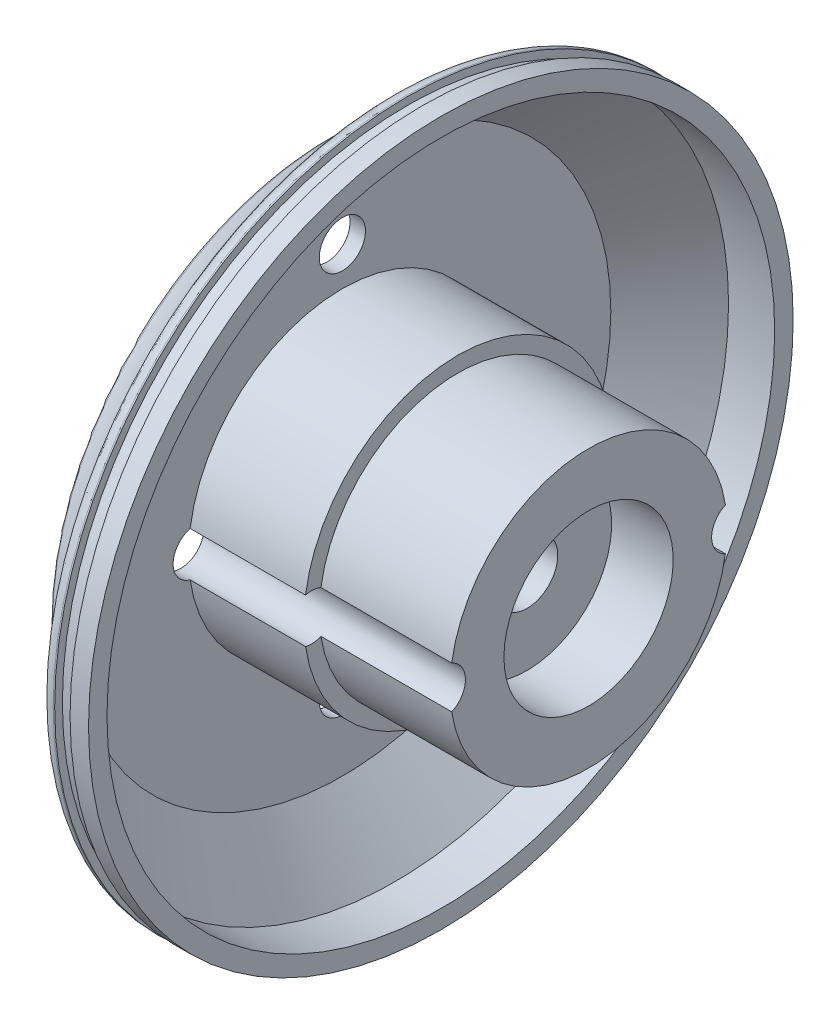
ISO-10303-21;
HEADER;
FILE_DESCRIPTION(('STEP AP214'),'2;1');
FILE_NAME('part.step','',(''),(''),'','','');
FILE_SCHEMA(('AUTOMOTIVE_DESIGN { 1 0 10303 214 1 1 1 1 }'));
ENDSEC;
DATA;
#1=APPLICATION_CONTEXT('core data for automotive mechanical design processes');
#2=APPLICATION_PROTOCOL_DEFINITION('international standard','automotive_design',2000,#1);
#3=PRODUCT_CONTEXT('',#1,'mechanical');
#4=PRODUCT('Part','Part','',(#3));
#5=PRODUCT_RELATED_PRODUCT_CATEGORY('part','',(#4));
#6=PRODUCT_DEFINITION_FORMATION('','',#4);
#7=PRODUCT_DEFINITION_CONTEXT('part definition',#1,'design');
#8=PRODUCT_DEFINITION('design','',#6,#7);
#9=PRODUCT_DEFINITION_SHAPE('','',#8);
#10=(LENGTH_UNIT() NAMED_UNIT(*) SI_UNIT(.MILLI.,.METRE.));
#11=(NAMED_UNIT(*) PLANE_ANGLE_UNIT() SI_UNIT($,.RADIAN.));
#12=(NAMED_UNIT(*) SI_UNIT($,.STERADIAN.) SOLID_ANGLE_UNIT());
#13=UNCERTAINTY_MEASURE_WITH_UNIT(LENGTH_MEASURE(1.E-05),#10,'distance_accuracy_value','');
#14=(GEOMETRIC_REPRESENTATION_CONTEXT(3) GLOBAL_UNCERTAINTY_ASSIGNED_CONTEXT((#13)) GLOBAL_UNIT_ASSIGNED_CONTEXT((#10,
#11,#12)) REPRESENTATION_CONTEXT('',''));
#15=CARTESIAN_POINT('',(0.,0.,0.));
#16=DIRECTION('',(0.,0.,1.));
#17=DIRECTION('',(1.,0.,0.));
#18=AXIS2_PLACEMENT_3D('',#15,#16,#17);
#19=CARTESIAN_POINT('',(0.,0.,0.));
#20=DIRECTION('',(-1.,0.,0.));
#21=DIRECTION('',(0.,0.,1.));
#22=AXIS2_PLACEMENT_3D('',#19,#20,#21);
#23=CYLINDRICAL_SURFACE('',#22,9.);
#24=CARTESIAN_POINT('',(8.5,0.,0.));
#25=DIRECTION('',(-1.,0.,0.));
#26=DIRECTION('',(0.,0.,1.));
#27=AXIS2_PLACEMENT_3D('',#24,#25,#26);
#28=CIRCLE('',#27,9.);
#29=CARTESIAN_POINT('',(8.5,1.37246366425319,8.89473684210526));
#30=VERTEX_POINT('',#29);
#31=CARTESIAN_POINT('',(8.5,1.37246366425319,-8.89473684210526));
#32=VERTEX_POINT('',#31);
#33=EDGE_CURVE('E126',#30,#32,#28,.T.);
#34=ORIENTED_EDGE('',*,*,#33,.F.);
#35=DIRECTION('',(-1.,0.,0.));
#36=VECTOR('',#35,1.);
#37=CARTESIAN_POINT('',(8.5,1.37246366425319,8.89473684210526));
#38=LINE('',#37,#36);
#39=CARTESIAN_POINT('',(17.,1.37246366425319,8.89473684210526));
#40=VERTEX_POINT('',#39);
#41=EDGE_CURVE('E109',#30,#40,#38,.F.);
#42=ORIENTED_EDGE('',*,*,#41,.T.);
#43=CARTESIAN_POINT('',(17.,0.,0.));
#44=DIRECTION('',(-1.,0.,0.));
#45=DIRECTION('',(0.,0.,1.));
#46=AXIS2_PLACEMENT_3D('',#43,#44,#45);
#47=CIRCLE('',#46,9.);
#48=CARTESIAN_POINT('',(17.,1.37246366425319,-8.89473684210526));
#49=VERTEX_POINT('',#48);
#50=EDGE_CURVE('E124',#40,#49,#47,.T.);
#51=ORIENTED_EDGE('',*,*,#50,.T.);
#52=DIRECTION('',(-1.,0.,0.));
#53=VECTOR('',#52,1.);
#54=CARTESIAN_POINT('',(8.5,1.37246366425319,-8.89473684210526));
#55=LINE('',#54,#53);
#56=EDGE_CURVE('E215',#49,#32,#55,.T.);
#57=ORIENTED_EDGE('',*,*,#56,.T.);
#58=EDGE_LOOP('',(#34,#42,#51,#57));
#59=FACE_BOUND('',#58,.T.);
#60=ADVANCED_FACE('F41',(#59),#23,.T.);
#61=CARTESIAN_POINT('',(8.5,0.,0.));
#62=DIRECTION('',(-1.,0.,0.));
#63=DIRECTION('',(0.,0.,1.));
#64=AXIS2_PLACEMENT_3D('',#61,#62,#63);
#65=PLANE('',#64);
#66=CARTESIAN_POINT('',(8.5,0.,0.));
#67=DIRECTION('',(-1.,0.,0.));
#68=DIRECTION('',(0.,0.,1.));
#69=AXIS2_PLACEMENT_3D('',#66,#67,#68);
#70=CIRCLE('',#69,10.);
#71=CARTESIAN_POINT('',(8.5,1.44712916682816,9.89473684210526));
#72=VERTEX_POINT('',#71);
#73=CARTESIAN_POINT('',(8.5,1.44712916682816,-9.89473684210526));
#74=VERTEX_POINT('',#73);
#75=EDGE_CURVE('E258',#72,#74,#70,.T.);
#76=ORIENTED_EDGE('',*,*,#75,.F.);
#77=CARTESIAN_POINT('',(8.5,0.,9.5));
#78=DIRECTION('',(-1.,0.,0.));
#79=DIRECTION('',(0.,0.,1.));
#80=AXIS2_PLACEMENT_3D('',#77,#78,#79);
#81=CIRCLE('',#80,1.5);
#82=EDGE_CURVE('E293',#72,#30,#81,.T.);
#83=ORIENTED_EDGE('',*,*,#82,.T.);
#84=ORIENTED_EDGE('',*,*,#33,.T.);
#85=CARTESIAN_POINT('',(8.5,0.,-9.5));
#86=DIRECTION('',(-1.,0.,0.));
#87=DIRECTION('',(0.,0.,1.));
#88=AXIS2_PLACEMENT_3D('',#85,#86,#87);
#89=CIRCLE('',#88,1.5);
#90=EDGE_CURVE('E214',#32,#74,#89,.T.);
#91=ORIENTED_EDGE('',*,*,#90,.T.);
#92=EDGE_LOOP('',(#76,#83,#84,#91));
#93=FACE_BOUND('',#92,.T.);
#94=ADVANCED_FACE('F276',(#93),#65,.F.);
#95=CARTESIAN_POINT('',(0.,0.,0.));
#96=DIRECTION('',(-1.,0.,0.));
#97=DIRECTION('',(0.,0.,1.));
#98=AXIS2_PLACEMENT_3D('',#95,#96,#97);
#99=CYLINDRICAL_SURFACE('',#98,10.);
#100=DIRECTION('',(-1.,0.,0.));
#101=VECTOR('',#100,1.);
#102=CARTESIAN_POINT('',(8.5,1.44712916682816,9.89473684210526));
#103=LINE('',#102,#101);
#104=CARTESIAN_POINT('',(0.999999999999997,1.44712916682816,9.89473684210526));
#105=VERTEX_POINT('',#104);
#106=EDGE_CURVE('E57',#72,#105,#103,.T.);
#107=ORIENTED_EDGE('',*,*,#106,.F.);
#108=ORIENTED_EDGE('',*,*,#75,.T.);
#109=DIRECTION('',(-1.,0.,0.));
#110=VECTOR('',#109,1.);
#111=CARTESIAN_POINT('',(8.5,1.44712916682816,-9.89473684210526));
#112=LINE('',#111,#110);
#113=CARTESIAN_POINT('',(0.999999999999997,1.44712916682816,-9.89473684210526));
#114=VERTEX_POINT('',#113);
#115=EDGE_CURVE('E203',#114,#74,#112,.F.);
#116=ORIENTED_EDGE('',*,*,#115,.F.);
#117=CARTESIAN_POINT('',(1.,0.,0.));
#118=DIRECTION('',(-1.,0.,0.));
#119=DIRECTION('',(0.,0.,1.));
#120=AXIS2_PLACEMENT_3D('',#117,#118,#119);
#121=CIRCLE('',#120,10.);
#122=EDGE_CURVE('E254',#105,#114,#121,.T.);
#123=ORIENTED_EDGE('',*,*,#122,.F.);
#124=EDGE_LOOP('',(#107,#108,#116,#123));
#125=FACE_BOUND('',#124,.T.);
#126=ADVANCED_FACE('F270',(#125),#99,.T.);
#127=CARTESIAN_POINT('',(-6.18335473428844,0.,0.));
#128=DIRECTION('',(-1.,0.,0.));
#129=DIRECTION('',(0.,0.,1.));
#130=AXIS2_PLACEMENT_3D('',#127,#128,#129);
#131=TOROIDAL_SURFACE('',#130,28.194917613122,11.9235154593095);
#132=CARTESIAN_POINT('',(4.23006744782491,0.,0.));
#133=DIRECTION('',(-1.,0.,0.));
#134=DIRECTION('',(0.,0.,1.));
#135=AXIS2_PLACEMENT_3D('',#132,#133,#134);
#136=CIRCLE('',#135,22.3870901909733);
#137=CARTESIAN_POINT('',(4.23006744782491,0.,22.3870901909733));
#138=VERTEX_POINT('',#137);
#139=EDGE_CURVE('E172',#138,#138,#136,.T.);
#140=ORIENTED_EDGE('',*,*,#139,.T.);
#141=EDGE_LOOP('',(#140));
#142=FACE_BOUND('',#141,.T.);
#143=CARTESIAN_POINT('',(0.444164031303579,0.,0.));
#144=DIRECTION('',(-1.,0.,0.));
#145=DIRECTION('',(0.,0.,1.));
#146=AXIS2_PLACEMENT_3D('',#143,#144,#145);
#147=CIRCLE('',#146,18.2829946957402);
#148=CARTESIAN_POINT('',(0.444164031303579,0.,18.2829946957402));
#149=VERTEX_POINT('',#148);
#150=EDGE_CURVE('E168',#149,#149,#147,.F.);
#151=ORIENTED_EDGE('',*,*,#150,.T.);
#152=EDGE_LOOP('',(#151));
#153=FACE_BOUND('',#152,.T.);
#154=ADVANCED_FACE('F339',(#142,#153),#131,.F.);
#155=CARTESIAN_POINT('',(0.,0.,0.));
#156=DIRECTION('',(-1.,0.,0.));
#157=DIRECTION('',(0.,0.,1.));
#158=AXIS2_PLACEMENT_3D('',#155,#156,#157);
#159=PLANE('',#158);
#160=CARTESIAN_POINT('',(0.,-12.5,0.));
#161=DIRECTION('',(-1.,0.,0.));
#162=DIRECTION('',(0.,-1.,0.));
#163=AXIS2_PLACEMENT_3D('',#160,#161,#162);
#164=CIRCLE('',#163,1.5);
#165=CARTESIAN_POINT('',(0.,-14.,0.));
#166=VERTEX_POINT('',#165);
#167=EDGE_CURVE('E422',#166,#166,#164,.T.);
#168=ORIENTED_EDGE('',*,*,#167,.F.);
#169=EDGE_LOOP('',(#168));
#170=FACE_BOUND('',#169,.T.);
#171=CARTESIAN_POINT('',(0.,0.,9.5));
#172=DIRECTION('',(-1.,0.,0.));
#173=DIRECTION('',(0.,-1.,0.));
#174=AXIS2_PLACEMENT_3D('',#171,#172,#173);
#175=CIRCLE('',#174,1.5);
#176=CARTESIAN_POINT('',(0.,-1.5,9.5));
#177=VERTEX_POINT('',#176);
#178=EDGE_CURVE('E119',#177,#177,#175,.T.);
#179=ORIENTED_EDGE('',*,*,#178,.F.);
#180=EDGE_LOOP('',(#179));
#181=FACE_BOUND('',#180,.T.);
#182=CARTESIAN_POINT('',(0.,12.5,0.));
#183=DIRECTION('',(-1.,0.,0.));
#184=DIRECTION('',(0.,-1.,0.));
#185=AXIS2_PLACEMENT_3D('',#182,#183,#184);
#186=CIRCLE('',#185,1.5);
#187=CARTESIAN_POINT('',(0.,11.,0.));
#188=VERTEX_POINT('',#187);
#189=EDGE_CURVE('E128',#188,#188,#186,.T.);
#190=ORIENTED_EDGE('',*,*,#189,.F.);
#191=EDGE_LOOP('',(#190));
#192=FACE_BOUND('',#191,.T.);
#193=CARTESIAN_POINT('',(0.,0.,-9.5));
#194=DIRECTION('',(-1.,0.,0.));
#195=DIRECTION('',(0.,-1.,0.));
#196=AXIS2_PLACEMENT_3D('',#193,#194,#195);
#197=CIRCLE('',#196,1.5);
#198=CARTESIAN_POINT('',(0.,-1.5,-9.5));
#199=VERTEX_POINT('',#198);
#200=EDGE_CURVE('E189',#199,#199,#197,.T.);
#201=ORIENTED_EDGE('',*,*,#200,.F.);
#202=EDGE_LOOP('',(#201));
#203=FACE_BOUND('',#202,.T.);
#204=CARTESIAN_POINT('',(0.,0.,0.));
#205=DIRECTION('',(-1.,0.,0.));
#206=DIRECTION('',(0.,0.,1.));
#207=AXIS2_PLACEMENT_3D('',#204,#205,#206);
#208=CIRCLE('',#207,17.4517027037763);
#209=CARTESIAN_POINT('',(0.,0.,17.4517027037763));
#210=VERTEX_POINT('',#209);
#211=EDGE_CURVE('E180',#210,#210,#208,.T.);
#212=ORIENTED_EDGE('',*,*,#211,.T.);
#213=EDGE_LOOP('',(#212));
#214=FACE_BOUND('',#213,.T.);
#215=CARTESIAN_POINT('',(0.,0.,0.));
#216=DIRECTION('',(-1.,0.,0.));
#217=DIRECTION('',(0.,0.,1.));
#218=AXIS2_PLACEMENT_3D('',#215,#216,#217);
#219=CIRCLE('',#218,5.5);
#220=CARTESIAN_POINT('',(0.,0.,5.5));
#221=VERTEX_POINT('',#220);
#222=EDGE_CURVE('E164',#221,#221,#219,.T.);
#223=ORIENTED_EDGE('',*,*,#222,.F.);
#224=EDGE_LOOP('',(#223));
#225=FACE_BOUND('',#224,.T.);
#226=ADVANCED_FACE('F335',(#170,#181,#192,#203,#214,#225),#159,.T.);
#227=CARTESIAN_POINT('',(0.,0.,0.));
#228=DIRECTION('',(-1.,0.,0.));
#229=DIRECTION('',(0.,0.,1.));
#230=AXIS2_PLACEMENT_3D('',#227,#228,#229);
#231=CYLINDRICAL_SURFACE('',#230,5.5);
#232=ORIENTED_EDGE('',*,*,#222,.T.);
#233=EDGE_LOOP('',(#232));
#234=FACE_BOUND('',#233,.T.);
#235=CARTESIAN_POINT('',(4.,0.,0.));
#236=DIRECTION('',(-1.,0.,0.));
#237=DIRECTION('',(0.,0.,1.));
#238=AXIS2_PLACEMENT_3D('',#235,#236,#237);
#239=CIRCLE('',#238,5.5);
#240=CARTESIAN_POINT('',(4.,0.,5.5));
#241=VERTEX_POINT('',#240);
#242=EDGE_CURVE('E160',#241,#241,#239,.T.);
#243=ORIENTED_EDGE('',*,*,#242,.F.);
#244=EDGE_LOOP('',(#243));
#245=FACE_BOUND('',#244,.T.);
#246=ADVANCED_FACE('F331',(#234,#245),#231,.F.);
#247=CARTESIAN_POINT('',(4.,0.,0.));
#248=DIRECTION('',(-1.,0.,0.));
#249=DIRECTION('',(0.,0.,1.));
#250=AXIS2_PLACEMENT_3D('',#247,#248,#249);
#251=PLANE('',#250);
#252=ORIENTED_EDGE('',*,*,#242,.T.);
#253=EDGE_LOOP('',(#252));
#254=FACE_BOUND('',#253,.T.);
#255=CARTESIAN_POINT('',(4.,0.,0.));
#256=DIRECTION('',(-1.,0.,0.));
#257=DIRECTION('',(0.,0.,1.));
#258=AXIS2_PLACEMENT_3D('',#255,#256,#257);
#259=CIRCLE('',#258,2.);
#260=CARTESIAN_POINT('',(4.,0.,2.));
#261=VERTEX_POINT('',#260);
#262=EDGE_CURVE('E156',#261,#261,#259,.T.);
#263=ORIENTED_EDGE('',*,*,#262,.F.);
#264=EDGE_LOOP('',(#263));
#265=FACE_BOUND('',#264,.T.);
#266=ADVANCED_FACE('F327',(#254,#265),#251,.T.);
#267=CARTESIAN_POINT('',(0.,0.,0.));
#268=DIRECTION('',(-1.,0.,0.));
#269=DIRECTION('',(0.,0.,1.));
#270=AXIS2_PLACEMENT_3D('',#267,#268,#269);
#271=CYLINDRICAL_SURFACE('',#270,2.);
#272=ORIENTED_EDGE('',*,*,#262,.T.);
#273=EDGE_LOOP('',(#272));
#274=FACE_BOUND('',#273,.T.);
#275=CARTESIAN_POINT('',(13.,0.,0.));
#276=DIRECTION('',(-1.,0.,0.));
#277=DIRECTION('',(0.,0.,1.));
#278=AXIS2_PLACEMENT_3D('',#275,#276,#277);
#279=CIRCLE('',#278,2.);
#280=CARTESIAN_POINT('',(13.,0.,2.));
#281=VERTEX_POINT('',#280);
#282=EDGE_CURVE('E152',#281,#281,#279,.T.);
#283=ORIENTED_EDGE('',*,*,#282,.F.);
#284=EDGE_LOOP('',(#283));
#285=FACE_BOUND('',#284,.T.);
#286=ADVANCED_FACE('F323',(#274,#285),#271,.F.);
#287=CARTESIAN_POINT('',(13.,0.,0.));
#288=DIRECTION('',(1.,0.,0.));
#289=DIRECTION('',(0.,0.,-1.));
#290=AXIS2_PLACEMENT_3D('',#287,#288,#289);
#291=PLANE('',#290);
#292=ORIENTED_EDGE('',*,*,#282,.T.);
#293=EDGE_LOOP('',(#292));
#294=FACE_BOUND('',#293,.T.);
#295=CARTESIAN_POINT('',(13.,0.,0.));
#296=DIRECTION('',(-1.,0.,0.));
#297=DIRECTION('',(0.,0.,1.));
#298=AXIS2_PLACEMENT_3D('',#295,#296,#297);
#299=CIRCLE('',#298,5.5);
#300=CARTESIAN_POINT('',(13.,0.,5.5));
#301=VERTEX_POINT('',#300);
#302=EDGE_CURVE('E148',#301,#301,#299,.T.);
#303=ORIENTED_EDGE('',*,*,#302,.F.);
#304=EDGE_LOOP('',(#303));
#305=FACE_BOUND('',#304,.T.);
#306=ADVANCED_FACE('F319',(#294,#305),#291,.T.);
#307=CARTESIAN_POINT('',(0.,0.,0.));
#308=DIRECTION('',(-1.,0.,0.));
#309=DIRECTION('',(0.,0.,1.));
#310=AXIS2_PLACEMENT_3D('',#307,#308,#309);
#311=CYLINDRICAL_SURFACE('',#310,5.5);
#312=ORIENTED_EDGE('',*,*,#302,.T.);
#313=EDGE_LOOP('',(#312));
#314=FACE_BOUND('',#313,.T.);
#315=CARTESIAN_POINT('',(17.,0.,0.));
#316=DIRECTION('',(-1.,0.,0.));
#317=DIRECTION('',(0.,0.,1.));
#318=AXIS2_PLACEMENT_3D('',#315,#316,#317);
#319=CIRCLE('',#318,5.5);
#320=CARTESIAN_POINT('',(17.,0.,5.5));
#321=VERTEX_POINT('',#320);
#322=EDGE_CURVE('E140',#321,#321,#319,.T.);
#323=ORIENTED_EDGE('',*,*,#322,.F.);
#324=EDGE_LOOP('',(#323));
#325=FACE_BOUND('',#324,.T.);
#326=ADVANCED_FACE('F316',(#314,#325),#311,.F.);
#327=CARTESIAN_POINT('',(17.,0.,0.));
#328=DIRECTION('',(1.,0.,0.));
#329=DIRECTION('',(0.,0.,-1.));
#330=AXIS2_PLACEMENT_3D('',#327,#328,#329);
#331=PLANE('',#330);
#332=CARTESIAN_POINT('',(17.,0.,9.5));
#333=DIRECTION('',(-1.,0.,0.));
#334=DIRECTION('',(0.,-1.,0.));
#335=AXIS2_PLACEMENT_3D('',#332,#333,#334);
#336=CIRCLE('',#335,1.5);
#337=CARTESIAN_POINT('',(17.,-1.37246366425319,8.89473684210526));
#338=VERTEX_POINT('',#337);
#339=EDGE_CURVE('E106',#40,#338,#336,.T.);
#340=ORIENTED_EDGE('',*,*,#339,.T.);
#341=CARTESIAN_POINT('',(17.,-1.37246366425319,-8.89473684210526));
#342=VERTEX_POINT('',#341);
#343=EDGE_CURVE('E135',#342,#338,#47,.T.);
#344=ORIENTED_EDGE('',*,*,#343,.F.);
#345=CARTESIAN_POINT('',(17.,0.,-9.5));
#346=DIRECTION('',(-1.,0.,0.));
#347=DIRECTION('',(0.,-1.,0.));
#348=AXIS2_PLACEMENT_3D('',#345,#346,#347);
#349=CIRCLE('',#348,1.5);
#350=EDGE_CURVE('E133',#342,#49,#349,.T.);
#351=ORIENTED_EDGE('',*,*,#350,.T.);
#352=ORIENTED_EDGE('',*,*,#50,.F.);
#353=EDGE_LOOP('',(#340,#344,#351,#352));
#354=FACE_BOUND('',#353,.T.);
#355=ORIENTED_EDGE('',*,*,#322,.T.);
#356=EDGE_LOOP('',(#355));
#357=FACE_BOUND('',#356,.T.);
#358=ADVANCED_FACE('F131',(#354,#357),#331,.T.);
#359=ORIENTED_EDGE('',*,*,#343,.T.);
#360=DIRECTION('',(-1.,0.,0.));
#361=VECTOR('',#360,1.);
#362=CARTESIAN_POINT('',(8.5,-1.37246366425319,8.89473684210526));
#363=LINE('',#362,#361);
#364=CARTESIAN_POINT('',(8.5,-1.37246366425319,8.89473684210526));
#365=VERTEX_POINT('',#364);
#366=EDGE_CURVE('E112',#338,#365,#363,.T.);
#367=ORIENTED_EDGE('',*,*,#366,.T.);
#368=CARTESIAN_POINT('',(8.5,-1.37246366425319,-8.89473684210526));
#369=VERTEX_POINT('',#368);
#370=EDGE_CURVE('E136',#369,#365,#28,.T.);
#371=ORIENTED_EDGE('',*,*,#370,.F.);
#372=DIRECTION('',(-1.,0.,0.));
#373=VECTOR('',#372,1.);
#374=CARTESIAN_POINT('',(8.5,-1.37246366425319,-8.89473684210526));
#375=LINE('',#374,#373);
#376=EDGE_CURVE('E218',#369,#342,#375,.F.);
#377=ORIENTED_EDGE('',*,*,#376,.T.);
#378=EDGE_LOOP('',(#359,#367,#371,#377));
#379=FACE_BOUND('',#378,.T.);
#380=ADVANCED_FACE('F298',(#379),#23,.T.);
#381=ORIENTED_EDGE('',*,*,#370,.T.);
#382=CARTESIAN_POINT('',(8.5,-1.44712916682816,9.89473684210526));
#383=VERTEX_POINT('',#382);
#384=EDGE_CURVE('E288',#365,#383,#81,.T.);
#385=ORIENTED_EDGE('',*,*,#384,.T.);
#386=CARTESIAN_POINT('',(8.5,-1.44712916682816,-9.89473684210526));
#387=VERTEX_POINT('',#386);
#388=EDGE_CURVE('E259',#387,#383,#70,.T.);
#389=ORIENTED_EDGE('',*,*,#388,.F.);
#390=EDGE_CURVE('E210',#387,#369,#89,.T.);
#391=ORIENTED_EDGE('',*,*,#390,.T.);
#392=EDGE_LOOP('',(#381,#385,#389,#391));
#393=FACE_BOUND('',#392,.T.);
#394=ADVANCED_FACE('F300',(#393),#65,.F.);
#395=DIRECTION('',(-1.,0.,0.));
#396=VECTOR('',#395,1.);
#397=CARTESIAN_POINT('',(8.5,-1.44712916682816,9.89473684210526));
#398=LINE('',#397,#396);
#399=CARTESIAN_POINT('',(0.999999999999997,-1.44712916682816,9.89473684210526));
#400=VERTEX_POINT('',#399);
#401=EDGE_CURVE('E118',#400,#383,#398,.F.);
#402=ORIENTED_EDGE('',*,*,#401,.F.);
#403=CARTESIAN_POINT('',(0.999999999999997,-1.44712916682816,-9.89473684210526));
#404=VERTEX_POINT('',#403);
#405=EDGE_CURVE('E255',#404,#400,#121,.T.);
#406=ORIENTED_EDGE('',*,*,#405,.F.);
#407=DIRECTION('',(-1.,0.,0.));
#408=VECTOR('',#407,1.);
#409=CARTESIAN_POINT('',(8.5,-1.44712916682816,-9.89473684210526));
#410=LINE('',#409,#408);
#411=EDGE_CURVE('E65',#387,#404,#410,.T.);
#412=ORIENTED_EDGE('',*,*,#411,.F.);
#413=ORIENTED_EDGE('',*,*,#388,.T.);
#414=EDGE_LOOP('',(#402,#406,#412,#413));
#415=FACE_BOUND('',#414,.T.);
#416=ADVANCED_FACE('F284',(#415),#99,.T.);
#417=CARTESIAN_POINT('',(0.999999999999998,0.,0.));
#418=DIRECTION('',(1.,0.,0.));
#419=DIRECTION('',(0.,0.,-1.));
#420=AXIS2_PLACEMENT_3D('',#417,#418,#419);
#421=PLANE('',#420);
#422=CARTESIAN_POINT('',(0.999999999999997,-12.5,0.));
#423=DIRECTION('',(1.,0.,0.));
#424=DIRECTION('',(0.,0.,-1.));
#425=AXIS2_PLACEMENT_3D('',#422,#423,#424);
#426=CIRCLE('',#425,1.5);
#427=CARTESIAN_POINT('',(0.999999999999997,-12.5,-1.5));
#428=VERTEX_POINT('',#427);
#429=EDGE_CURVE('E45',#428,#428,#426,.T.);
#430=ORIENTED_EDGE('',*,*,#429,.F.);
#431=EDGE_LOOP('',(#430));
#432=FACE_BOUND('',#431,.T.);
#433=CARTESIAN_POINT('',(0.999999999999997,0.,9.5));
#434=DIRECTION('',(1.,0.,0.));
#435=DIRECTION('',(0.,0.,-1.));
#436=AXIS2_PLACEMENT_3D('',#433,#434,#435);
#437=CIRCLE('',#436,1.5);
#438=EDGE_CURVE('E11',#105,#400,#437,.T.);
#439=ORIENTED_EDGE('',*,*,#438,.F.);
#440=ORIENTED_EDGE('',*,*,#122,.T.);
#441=CARTESIAN_POINT('',(0.999999999999997,0.,-9.5));
#442=DIRECTION('',(1.,0.,0.));
#443=DIRECTION('',(0.,0.,-1.));
#444=AXIS2_PLACEMENT_3D('',#441,#442,#443);
#445=CIRCLE('',#444,1.5);
#446=EDGE_CURVE('E51',#404,#114,#445,.T.);
#447=ORIENTED_EDGE('',*,*,#446,.F.);
#448=ORIENTED_EDGE('',*,*,#405,.T.);
#449=EDGE_LOOP('',(#439,#440,#447,#448));
#450=FACE_BOUND('',#449,.T.);
#451=CARTESIAN_POINT('',(0.999999999999997,12.5,0.));
#452=DIRECTION('',(1.,0.,0.));
#453=DIRECTION('',(0.,0.,-1.));
#454=AXIS2_PLACEMENT_3D('',#451,#452,#453);
#455=CIRCLE('',#454,1.5);
#456=CARTESIAN_POINT('',(0.999999999999997,12.5,-1.5));
#457=VERTEX_POINT('',#456);
#458=EDGE_CURVE('E186',#457,#457,#455,.T.);
#459=ORIENTED_EDGE('',*,*,#458,.F.);
#460=EDGE_LOOP('',(#459));
#461=FACE_BOUND('',#460,.T.);
#462=CARTESIAN_POINT('',(0.999999999999996,0.,0.));
#463=DIRECTION('',(-1.,0.,0.));
#464=DIRECTION('',(0.,0.,1.));
#465=AXIS2_PLACEMENT_3D('',#462,#463,#464);
#466=CIRCLE('',#465,17.4468871308271);
#467=CARTESIAN_POINT('',(0.999999999999996,0.,17.4468871308271));
#468=VERTEX_POINT('',#467);
#469=EDGE_CURVE('E250',#468,#468,#466,.T.);
#470=ORIENTED_EDGE('',*,*,#469,.F.);
#471=EDGE_LOOP('',(#470));
#472=FACE_BOUND('',#471,.T.);
#473=ADVANCED_FACE('F280',(#432,#450,#461,#472),#421,.T.);
#474=CARTESIAN_POINT('',(0.999999999999996,0.,0.));
#475=DIRECTION('',(1.,0.,0.));
#476=DIRECTION('',(0.,0.,-1.));
#477=AXIS2_PLACEMENT_3D('',#474,#475,#476);
#478=CONICAL_SURFACE('',#477,17.4468871308271,0.896412512769206);
#479=CARTESIAN_POINT('',(4.4,0.,0.));
#480=DIRECTION('',(-1.,0.,0.));
#481=DIRECTION('',(0.,0.,1.));
#482=AXIS2_PLACEMENT_3D('',#479,#480,#481);
#483=CIRCLE('',#482,21.7);
#484=CARTESIAN_POINT('',(4.4,0.,21.7));
#485=VERTEX_POINT('',#484);
#486=EDGE_CURVE('E246',#485,#485,#483,.T.);
#487=ORIENTED_EDGE('',*,*,#486,.F.);
#488=EDGE_LOOP('',(#487));
#489=FACE_BOUND('',#488,.T.);
#490=ORIENTED_EDGE('',*,*,#469,.T.);
#491=EDGE_LOOP('',(#490));
#492=FACE_BOUND('',#491,.T.);
#493=ADVANCED_FACE('F409',(#489,#492),#478,.F.);
#494=CARTESIAN_POINT('',(0.,0.,0.));
#495=DIRECTION('',(-1.,0.,0.));
#496=DIRECTION('',(0.,0.,1.));
#497=AXIS2_PLACEMENT_3D('',#494,#495,#496);
#498=CYLINDRICAL_SURFACE('',#497,21.7);
#499=CARTESIAN_POINT('',(7.4,0.,0.));
#500=DIRECTION('',(-1.,0.,0.));
#501=DIRECTION('',(0.,0.,1.));
#502=AXIS2_PLACEMENT_3D('',#499,#500,#501);
#503=CIRCLE('',#502,21.7);
#504=CARTESIAN_POINT('',(7.4,0.,21.7));
#505=VERTEX_POINT('',#504);
#506=EDGE_CURVE('E242',#505,#505,#503,.T.);
#507=ORIENTED_EDGE('',*,*,#506,.F.);
#508=EDGE_LOOP('',(#507));
#509=FACE_BOUND('',#508,.T.);
#510=ORIENTED_EDGE('',*,*,#486,.T.);
#511=EDGE_LOOP('',(#510));
#512=FACE_BOUND('',#511,.T.);
#513=ADVANCED_FACE('F403',(#509,#512),#498,.F.);
#514=CARTESIAN_POINT('',(7.4,0.,0.));
#515=DIRECTION('',(-1.,0.,0.));
#516=DIRECTION('',(0.,0.,1.));
#517=AXIS2_PLACEMENT_3D('',#514,#515,#516);
#518=PLANE('',#517);
#519=CARTESIAN_POINT('',(7.4,0.,0.));
#520=DIRECTION('',(-1.,0.,0.));
#521=DIRECTION('',(0.,0.,1.));
#522=AXIS2_PLACEMENT_3D('',#519,#520,#521);
#523=CIRCLE('',#522,22.9);
#524=CARTESIAN_POINT('',(7.4,0.,22.9));
#525=VERTEX_POINT('',#524);
#526=EDGE_CURVE('E238',#525,#525,#523,.T.);
#527=ORIENTED_EDGE('',*,*,#526,.F.);
#528=EDGE_LOOP('',(#527));
#529=FACE_BOUND('',#528,.T.);
#530=ORIENTED_EDGE('',*,*,#506,.T.);
#531=EDGE_LOOP('',(#530));
#532=FACE_BOUND('',#531,.T.);
#533=ADVANCED_FACE('F397',(#529,#532),#518,.F.);
#534=CARTESIAN_POINT('',(0.,0.,0.));
#535=DIRECTION('',(-1.,0.,0.));
#536=DIRECTION('',(0.,0.,1.));
#537=AXIS2_PLACEMENT_3D('',#534,#535,#536);
#538=CYLINDRICAL_SURFACE('',#537,22.9);
#539=ORIENTED_EDGE('',*,*,#526,.T.);
#540=EDGE_LOOP('',(#539));
#541=FACE_BOUND('',#540,.T.);
#542=CARTESIAN_POINT('',(6.2,0.,0.));
#543=DIRECTION('',(-1.,0.,0.));
#544=DIRECTION('',(0.,0.,1.));
#545=AXIS2_PLACEMENT_3D('',#542,#543,#544);
#546=CIRCLE('',#545,22.9);
#547=CARTESIAN_POINT('',(6.2,0.,22.9));
#548=VERTEX_POINT('',#547);
#549=EDGE_CURVE('E234',#548,#548,#546,.T.);
#550=ORIENTED_EDGE('',*,*,#549,.F.);
#551=EDGE_LOOP('',(#550));
#552=FACE_BOUND('',#551,.T.);
#553=ADVANCED_FACE('F392',(#541,#552),#538,.T.);
#554=CARTESIAN_POINT('',(6.2,0.,0.));
#555=DIRECTION('',(1.,0.,0.));
#556=DIRECTION('',(0.,0.,-1.));
#557=AXIS2_PLACEMENT_3D('',#554,#555,#556);
#558=PLANE('',#557);
#559=CARTESIAN_POINT('',(6.2,0.,0.));
#560=DIRECTION('',(-1.,0.,0.));
#561=DIRECTION('',(0.,0.,1.));
#562=AXIS2_PLACEMENT_3D('',#559,#560,#561);
#563=CIRCLE('',#562,22.4);
#564=CARTESIAN_POINT('',(6.2,0.,22.4));
#565=VERTEX_POINT('',#564);
#566=EDGE_CURVE('E230',#565,#565,#563,.T.);
#567=ORIENTED_EDGE('',*,*,#566,.F.);
#568=EDGE_LOOP('',(#567));
#569=FACE_BOUND('',#568,.T.);
#570=ORIENTED_EDGE('',*,*,#549,.T.);
#571=EDGE_LOOP('',(#570));
#572=FACE_BOUND('',#571,.T.);
#573=ADVANCED_FACE('F386',(#569,#572),#558,.F.);
#574=CARTESIAN_POINT('',(0.,0.,0.));
#575=DIRECTION('',(-1.,0.,0.));
#576=DIRECTION('',(0.,0.,1.));
#577=AXIS2_PLACEMENT_3D('',#574,#575,#576);
#578=CYLINDRICAL_SURFACE('',#577,22.4);
#579=CARTESIAN_POINT('',(5.2,0.,0.));
#580=DIRECTION('',(-1.,0.,0.));
#581=DIRECTION('',(0.,0.,1.));
#582=AXIS2_PLACEMENT_3D('',#579,#580,#581);
#583=CIRCLE('',#582,22.4);
#584=CARTESIAN_POINT('',(5.2,0.,22.4));
#585=VERTEX_POINT('',#584);
#586=EDGE_CURVE('E226',#585,#585,#583,.T.);
#587=ORIENTED_EDGE('',*,*,#586,.F.);
#588=EDGE_LOOP('',(#587));
#589=FACE_BOUND('',#588,.T.);
#590=ORIENTED_EDGE('',*,*,#566,.T.);
#591=EDGE_LOOP('',(#590));
#592=FACE_BOUND('',#591,.T.);
#593=ADVANCED_FACE('F380',(#589,#592),#578,.T.);
#594=CARTESIAN_POINT('',(5.2,0.,0.));
#595=DIRECTION('',(-1.,0.,0.));
#596=DIRECTION('',(0.,0.,1.));
#597=AXIS2_PLACEMENT_3D('',#594,#595,#596);
#598=PLANE('',#597);
#599=CARTESIAN_POINT('',(5.2,0.,0.));
#600=DIRECTION('',(-1.,0.,0.));
#601=DIRECTION('',(0.,0.,1.));
#602=AXIS2_PLACEMENT_3D('',#599,#600,#601);
#603=CIRCLE('',#602,22.9);
#604=CARTESIAN_POINT('',(5.2,0.,22.9));
#605=VERTEX_POINT('',#604);
#606=EDGE_CURVE('E222',#605,#605,#603,.T.);
#607=ORIENTED_EDGE('',*,*,#606,.F.);
#608=EDGE_LOOP('',(#607));
#609=FACE_BOUND('',#608,.T.);
#610=ORIENTED_EDGE('',*,*,#586,.T.);
#611=EDGE_LOOP('',(#610));
#612=FACE_BOUND('',#611,.T.);
#613=ADVANCED_FACE('F352',(#609,#612),#598,.F.);
#614=CARTESIAN_POINT('',(0.,0.,0.));
#615=DIRECTION('',(-1.,0.,0.));
#616=DIRECTION('',(0.,0.,1.));
#617=AXIS2_PLACEMENT_3D('',#614,#615,#616);
#618=CYLINDRICAL_SURFACE('',#617,22.9);
#619=CARTESIAN_POINT('',(5.10341912146937,0.,0.));
#620=DIRECTION('',(1.,0.,0.));
#621=DIRECTION('',(0.,0.,-1.));
#622=AXIS2_PLACEMENT_3D('',#619,#620,#621);
#623=CIRCLE('',#622,22.9);
#624=CARTESIAN_POINT('',(5.10341912146937,0.,-22.9));
#625=VERTEX_POINT('',#624);
#626=EDGE_CURVE('E176',#625,#625,#623,.T.);
#627=ORIENTED_EDGE('',*,*,#626,.T.);
#628=EDGE_LOOP('',(#627));
#629=FACE_BOUND('',#628,.T.);
#630=ORIENTED_EDGE('',*,*,#606,.T.);
#631=EDGE_LOOP('',(#630));
#632=FACE_BOUND('',#631,.T.);
#633=ADVANCED_FACE('F345',(#629,#632),#618,.T.);
#634=CARTESIAN_POINT('',(5.10341912146937,0.,0.));
#635=DIRECTION('',(1.,0.,0.));
#636=DIRECTION('',(0.,0.,-1.));
#637=AXIS2_PLACEMENT_3D('',#634,#635,#636);
#638=TOROIDAL_SURFACE('',#637,21.9,1.);
#639=ORIENTED_EDGE('',*,*,#626,.F.);
#640=EDGE_LOOP('',(#639));
#641=FACE_BOUND('',#640,.T.);
#642=ORIENTED_EDGE('',*,*,#139,.F.);
#643=EDGE_LOOP('',(#642));
#644=FACE_BOUND('',#643,.T.);
#645=ADVANCED_FACE('F343',(#641,#644),#638,.T.);
#646=CARTESIAN_POINT('',(1.,0.,0.));
#647=DIRECTION('',(1.,0.,0.));
#648=DIRECTION('',(0.,0.,-1.));
#649=AXIS2_PLACEMENT_3D('',#646,#647,#648);
#650=TOROIDAL_SURFACE('',#649,17.4517027037763,1.);
#651=ORIENTED_EDGE('',*,*,#150,.F.);
#652=EDGE_LOOP('',(#651));
#653=FACE_BOUND('',#652,.T.);
#654=ORIENTED_EDGE('',*,*,#211,.F.);
#655=EDGE_LOOP('',(#654));
#656=FACE_BOUND('',#655,.T.);
#657=ADVANCED_FACE('F43',(#653,#656),#650,.T.);
#658=CARTESIAN_POINT('',(17.,0.,-9.5));
#659=DIRECTION('',(-1.,0.,0.));
#660=DIRECTION('',(0.,-1.,0.));
#661=AXIS2_PLACEMENT_3D('',#658,#659,#660);
#662=CYLINDRICAL_SURFACE('',#661,1.5);
#663=ORIENTED_EDGE('',*,*,#200,.T.);
#664=EDGE_LOOP('',(#663));
#665=FACE_BOUND('',#664,.T.);
#666=ORIENTED_EDGE('',*,*,#390,.F.);
#667=ORIENTED_EDGE('',*,*,#411,.T.);
#668=ORIENTED_EDGE('',*,*,#446,.T.);
#669=ORIENTED_EDGE('',*,*,#115,.T.);
#670=ORIENTED_EDGE('',*,*,#90,.F.);
#671=ORIENTED_EDGE('',*,*,#56,.F.);
#672=ORIENTED_EDGE('',*,*,#350,.F.);
#673=ORIENTED_EDGE('',*,*,#376,.F.);
#674=EDGE_LOOP('',(#666,#667,#668,#669,#670,#671,#672,#673));
#675=FACE_BOUND('',#674,.T.);
#676=ADVANCED_FACE('F275',(#665,#675),#662,.F.);
#677=CARTESIAN_POINT('',(17.,12.5,0.));
#678=DIRECTION('',(-1.,0.,0.));
#679=DIRECTION('',(0.,-1.,0.));
#680=AXIS2_PLACEMENT_3D('',#677,#678,#679);
#681=CYLINDRICAL_SURFACE('',#680,1.5);
#682=ORIENTED_EDGE('',*,*,#458,.T.);
#683=EDGE_LOOP('',(#682));
#684=FACE_BOUND('',#683,.T.);
#685=ORIENTED_EDGE('',*,*,#189,.T.);
#686=EDGE_LOOP('',(#685));
#687=FACE_BOUND('',#686,.T.);
#688=ADVANCED_FACE('F438',(#684,#687),#681,.F.);
#689=CARTESIAN_POINT('',(17.,0.,9.5));
#690=DIRECTION('',(-1.,0.,0.));
#691=DIRECTION('',(0.,-1.,0.));
#692=AXIS2_PLACEMENT_3D('',#689,#690,#691);
#693=CYLINDRICAL_SURFACE('',#692,1.5);
#694=ORIENTED_EDGE('',*,*,#178,.T.);
#695=EDGE_LOOP('',(#694));
#696=FACE_BOUND('',#695,.T.);
#697=ORIENTED_EDGE('',*,*,#82,.F.);
#698=ORIENTED_EDGE('',*,*,#106,.T.);
#699=ORIENTED_EDGE('',*,*,#438,.T.);
#700=ORIENTED_EDGE('',*,*,#401,.T.);
#701=ORIENTED_EDGE('',*,*,#384,.F.);
#702=ORIENTED_EDGE('',*,*,#366,.F.);
#703=ORIENTED_EDGE('',*,*,#339,.F.);
#704=ORIENTED_EDGE('',*,*,#41,.F.);
#705=EDGE_LOOP('',(#697,#698,#699,#700,#701,#702,#703,#704));
#706=FACE_BOUND('',#705,.T.);
#707=ADVANCED_FACE('F108',(#696,#706),#693,.F.);
#708=CARTESIAN_POINT('',(17.,-12.5,0.));
#709=DIRECTION('',(-1.,0.,0.));
#710=DIRECTION('',(0.,-1.,0.));
#711=AXIS2_PLACEMENT_3D('',#708,#709,#710);
#712=CYLINDRICAL_SURFACE('',#711,1.5);
#713=ORIENTED_EDGE('',*,*,#429,.T.);
#714=EDGE_LOOP('',(#713));
#715=FACE_BOUND('',#714,.T.);
#716=ORIENTED_EDGE('',*,*,#167,.T.);
#717=EDGE_LOOP('',(#716));
#718=FACE_BOUND('',#717,.T.);
#719=ADVANCED_FACE('F430',(#715,#718),#712,.F.);
#720=CLOSED_SHELL('',(#60,#94,#126,#154,#226,#246,#266,#286,#306,#326,#358,#380,#394,#416,#473,
#493,#513,#533,#553,#573,#593,#613,#633,#645,#657,#676,#688,#707,#719));
#721=MANIFOLD_SOLID_BREP('B2',#720);
#722=ADVANCED_BREP_SHAPE_REPRESENTATION('',(#18,#721),#14);
#723=SHAPE_DEFINITION_REPRESENTATION(#9,#722);
ENDSEC;
END-ISO-10303-21;
